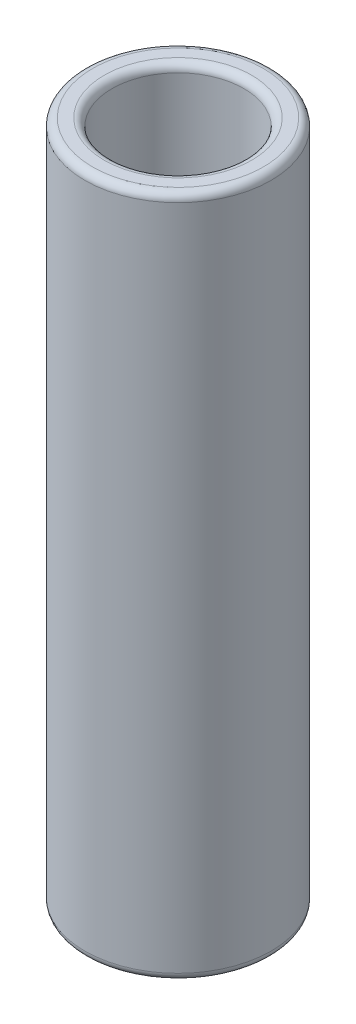
ISO-10303-21;
HEADER;
FILE_DESCRIPTION(('STEP AP214'),'2;1');
FILE_NAME('part.step','',(''),(''),'','','');
FILE_SCHEMA(('AUTOMOTIVE_DESIGN { 1 0 10303 214 1 1 1 1 }'));
ENDSEC;
DATA;
#1=APPLICATION_CONTEXT('core data for automotive mechanical design processes');
#2=APPLICATION_PROTOCOL_DEFINITION('international standard','automotive_design',2000,#1);
#3=PRODUCT_CONTEXT('',#1,'mechanical');
#4=PRODUCT('Part','Part','',(#3));
#5=PRODUCT_RELATED_PRODUCT_CATEGORY('part','',(#4));
#6=PRODUCT_DEFINITION_FORMATION('','',#4);
#7=PRODUCT_DEFINITION_CONTEXT('part definition',#1,'design');
#8=PRODUCT_DEFINITION('design','',#6,#7);
#9=PRODUCT_DEFINITION_SHAPE('','',#8);
#10=(LENGTH_UNIT() NAMED_UNIT(*) SI_UNIT(.MILLI.,.METRE.));
#11=(NAMED_UNIT(*) PLANE_ANGLE_UNIT() SI_UNIT($,.RADIAN.));
#12=(NAMED_UNIT(*) SI_UNIT($,.STERADIAN.) SOLID_ANGLE_UNIT());
#13=UNCERTAINTY_MEASURE_WITH_UNIT(LENGTH_MEASURE(1.E-05),#10,'distance_accuracy_value','');
#14=(GEOMETRIC_REPRESENTATION_CONTEXT(3) GLOBAL_UNCERTAINTY_ASSIGNED_CONTEXT((#13)) GLOBAL_UNIT_ASSIGNED_CONTEXT((#10,
#11,#12)) REPRESENTATION_CONTEXT('',''));
#15=CARTESIAN_POINT('',(0.,0.,0.));
#16=DIRECTION('',(0.,0.,1.));
#17=DIRECTION('',(1.,0.,0.));
#18=AXIS2_PLACEMENT_3D('',#15,#16,#17);
#19=CARTESIAN_POINT('',(0.,44.,0.));
#20=DIRECTION('',(0.,1.,0.));
#21=DIRECTION('',(0.,0.,1.));
#22=AXIS2_PLACEMENT_3D('',#19,#20,#21);
#23=PLANE('',#22);
#24=CARTESIAN_POINT('',(0.,44.,0.));
#25=DIRECTION('',(0.,1.,0.));
#26=DIRECTION('',(0.,0.,1.));
#27=AXIS2_PLACEMENT_3D('',#24,#25,#26);
#28=CIRCLE('',#27,5.5);
#29=CARTESIAN_POINT('',(0.,44.,5.5));
#30=VERTEX_POINT('',#29);
#31=EDGE_CURVE('E42',#30,#30,#28,.T.);
#32=ORIENTED_EDGE('',*,*,#31,.T.);
#33=EDGE_LOOP('',(#32));
#34=FACE_BOUND('',#33,.T.);
#35=CARTESIAN_POINT('',(0.,44.,0.));
#36=DIRECTION('',(0.,1.,0.));
#37=DIRECTION('',(0.,0.,1.));
#38=AXIS2_PLACEMENT_3D('',#35,#36,#37);
#39=CIRCLE('',#38,4.75);
#40=CARTESIAN_POINT('',(0.,44.,4.75));
#41=VERTEX_POINT('',#40);
#42=EDGE_CURVE('E46',#41,#41,#39,.F.);
#43=ORIENTED_EDGE('',*,*,#42,.T.);
#44=EDGE_LOOP('',(#43));
#45=FACE_BOUND('',#44,.T.);
#46=ADVANCED_FACE('F31',(#34,#45),#23,.T.);
#47=CARTESIAN_POINT('',(0.,0.,0.));
#48=DIRECTION('',(0.,1.,0.));
#49=DIRECTION('',(0.,0.,1.));
#50=AXIS2_PLACEMENT_3D('',#47,#48,#49);
#51=PLANE('',#50);
#52=CARTESIAN_POINT('',(0.,0.,0.));
#53=DIRECTION('',(0.,1.,0.));
#54=DIRECTION('',(0.,0.,1.));
#55=AXIS2_PLACEMENT_3D('',#52,#53,#54);
#56=CIRCLE('',#55,5.5);
#57=CARTESIAN_POINT('',(0.,0.,5.5));
#58=VERTEX_POINT('',#57);
#59=EDGE_CURVE('E51',#58,#58,#56,.F.);
#60=ORIENTED_EDGE('',*,*,#59,.T.);
#61=EDGE_LOOP('',(#60));
#62=FACE_BOUND('',#61,.T.);
#63=CARTESIAN_POINT('',(0.,0.,0.));
#64=DIRECTION('',(0.,1.,0.));
#65=DIRECTION('',(0.,0.,1.));
#66=AXIS2_PLACEMENT_3D('',#63,#64,#65);
#67=CIRCLE('',#66,4.75);
#68=CARTESIAN_POINT('',(0.,0.,4.75));
#69=VERTEX_POINT('',#68);
#70=EDGE_CURVE('E54',#69,#69,#67,.T.);
#71=ORIENTED_EDGE('',*,*,#70,.T.);
#72=EDGE_LOOP('',(#71));
#73=FACE_BOUND('',#72,.T.);
#74=ADVANCED_FACE('F76',(#62,#73),#51,.F.);
#75=CARTESIAN_POINT('',(0.,44.,0.));
#76=DIRECTION('',(0.,-1.,0.));
#77=DIRECTION('',(0.,0.,-1.));
#78=AXIS2_PLACEMENT_3D('',#75,#76,#77);
#79=CYLINDRICAL_SURFACE('',#78,6.);
#80=CARTESIAN_POINT('',(0.,0.5,0.));
#81=DIRECTION('',(0.,1.,0.));
#82=DIRECTION('',(0.,0.,1.));
#83=AXIS2_PLACEMENT_3D('',#80,#81,#82);
#84=CIRCLE('',#83,6.);
#85=CARTESIAN_POINT('',(0.,0.5,6.));
#86=VERTEX_POINT('',#85);
#87=EDGE_CURVE('E57',#86,#86,#84,.T.);
#88=ORIENTED_EDGE('',*,*,#87,.T.);
#89=EDGE_LOOP('',(#88));
#90=FACE_BOUND('',#89,.T.);
#91=CARTESIAN_POINT('',(0.,43.5,0.));
#92=DIRECTION('',(0.,1.,0.));
#93=DIRECTION('',(0.,0.,1.));
#94=AXIS2_PLACEMENT_3D('',#91,#92,#93);
#95=CIRCLE('',#94,6.);
#96=CARTESIAN_POINT('',(0.,43.5,6.));
#97=VERTEX_POINT('',#96);
#98=EDGE_CURVE('E60',#97,#97,#95,.F.);
#99=ORIENTED_EDGE('',*,*,#98,.T.);
#100=EDGE_LOOP('',(#99));
#101=FACE_BOUND('',#100,.T.);
#102=ADVANCED_FACE('F64',(#90,#101),#79,.T.);
#103=CARTESIAN_POINT('',(0.,44.,0.));
#104=DIRECTION('',(0.,-1.,0.));
#105=DIRECTION('',(0.,0.,-1.));
#106=AXIS2_PLACEMENT_3D('',#103,#104,#105);
#107=CYLINDRICAL_SURFACE('',#106,4.25);
#108=CARTESIAN_POINT('',(0.,0.5,0.));
#109=DIRECTION('',(0.,1.,0.));
#110=DIRECTION('',(0.,0.,1.));
#111=AXIS2_PLACEMENT_3D('',#108,#109,#110);
#112=CIRCLE('',#111,4.25);
#113=CARTESIAN_POINT('',(0.,0.5,4.25));
#114=VERTEX_POINT('',#113);
#115=EDGE_CURVE('E10',#114,#114,#112,.F.);
#116=ORIENTED_EDGE('',*,*,#115,.T.);
#117=EDGE_LOOP('',(#116));
#118=FACE_BOUND('',#117,.T.);
#119=CARTESIAN_POINT('',(0.,43.5,0.));
#120=DIRECTION('',(0.,1.,0.));
#121=DIRECTION('',(0.,0.,1.));
#122=AXIS2_PLACEMENT_3D('',#119,#120,#121);
#123=CIRCLE('',#122,4.25);
#124=CARTESIAN_POINT('',(0.,43.5,4.25));
#125=VERTEX_POINT('',#124);
#126=EDGE_CURVE('E38',#125,#125,#123,.T.);
#127=ORIENTED_EDGE('',*,*,#126,.T.);
#128=EDGE_LOOP('',(#127));
#129=FACE_BOUND('',#128,.T.);
#130=ADVANCED_FACE('F92',(#118,#129),#107,.F.);
#131=CARTESIAN_POINT('',(0.,0.5,0.));
#132=DIRECTION('',(0.,1.,0.));
#133=DIRECTION('',(0.,0.,1.));
#134=AXIS2_PLACEMENT_3D('',#131,#132,#133);
#135=TOROIDAL_SURFACE('',#134,5.5,0.5);
#136=ORIENTED_EDGE('',*,*,#59,.F.);
#137=EDGE_LOOP('',(#136));
#138=FACE_BOUND('',#137,.T.);
#139=ORIENTED_EDGE('',*,*,#87,.F.);
#140=EDGE_LOOP('',(#139));
#141=FACE_BOUND('',#140,.T.);
#142=ADVANCED_FACE('F70',(#138,#141),#135,.T.);
#143=CARTESIAN_POINT('',(0.,43.5,0.));
#144=DIRECTION('',(0.,1.,0.));
#145=DIRECTION('',(0.,0.,1.));
#146=AXIS2_PLACEMENT_3D('',#143,#144,#145);
#147=TOROIDAL_SURFACE('',#146,5.5,0.5);
#148=ORIENTED_EDGE('',*,*,#98,.F.);
#149=EDGE_LOOP('',(#148));
#150=FACE_BOUND('',#149,.T.);
#151=ORIENTED_EDGE('',*,*,#31,.F.);
#152=EDGE_LOOP('',(#151));
#153=FACE_BOUND('',#152,.T.);
#154=ADVANCED_FACE('F66',(#150,#153),#147,.T.);
#155=CARTESIAN_POINT('',(0.,0.5,0.));
#156=DIRECTION('',(0.,1.,0.));
#157=DIRECTION('',(0.,0.,1.));
#158=AXIS2_PLACEMENT_3D('',#155,#156,#157);
#159=TOROIDAL_SURFACE('',#158,4.75,0.5);
#160=ORIENTED_EDGE('',*,*,#115,.F.);
#161=EDGE_LOOP('',(#160));
#162=FACE_BOUND('',#161,.T.);
#163=ORIENTED_EDGE('',*,*,#70,.F.);
#164=EDGE_LOOP('',(#163));
#165=FACE_BOUND('',#164,.T.);
#166=ADVANCED_FACE('F69',(#162,#165),#159,.T.);
#167=CARTESIAN_POINT('',(0.,43.5,0.));
#168=DIRECTION('',(0.,1.,0.));
#169=DIRECTION('',(0.,0.,1.));
#170=AXIS2_PLACEMENT_3D('',#167,#168,#169);
#171=TOROIDAL_SURFACE('',#170,4.75,0.5);
#172=ORIENTED_EDGE('',*,*,#42,.F.);
#173=EDGE_LOOP('',(#172));
#174=FACE_BOUND('',#173,.T.);
#175=ORIENTED_EDGE('',*,*,#126,.F.);
#176=EDGE_LOOP('',(#175));
#177=FACE_BOUND('',#176,.T.);
#178=ADVANCED_FACE('F33',(#174,#177),#171,.T.);
#179=CLOSED_SHELL('',(#46,#74,#102,#130,#142,#154,#166,#178));
#180=MANIFOLD_SOLID_BREP('B2',#179);
#181=ADVANCED_BREP_SHAPE_REPRESENTATION('',(#18,#180),#14);
#182=SHAPE_DEFINITION_REPRESENTATION(#9,#181);
ENDSEC;
END-ISO-10303-21;
